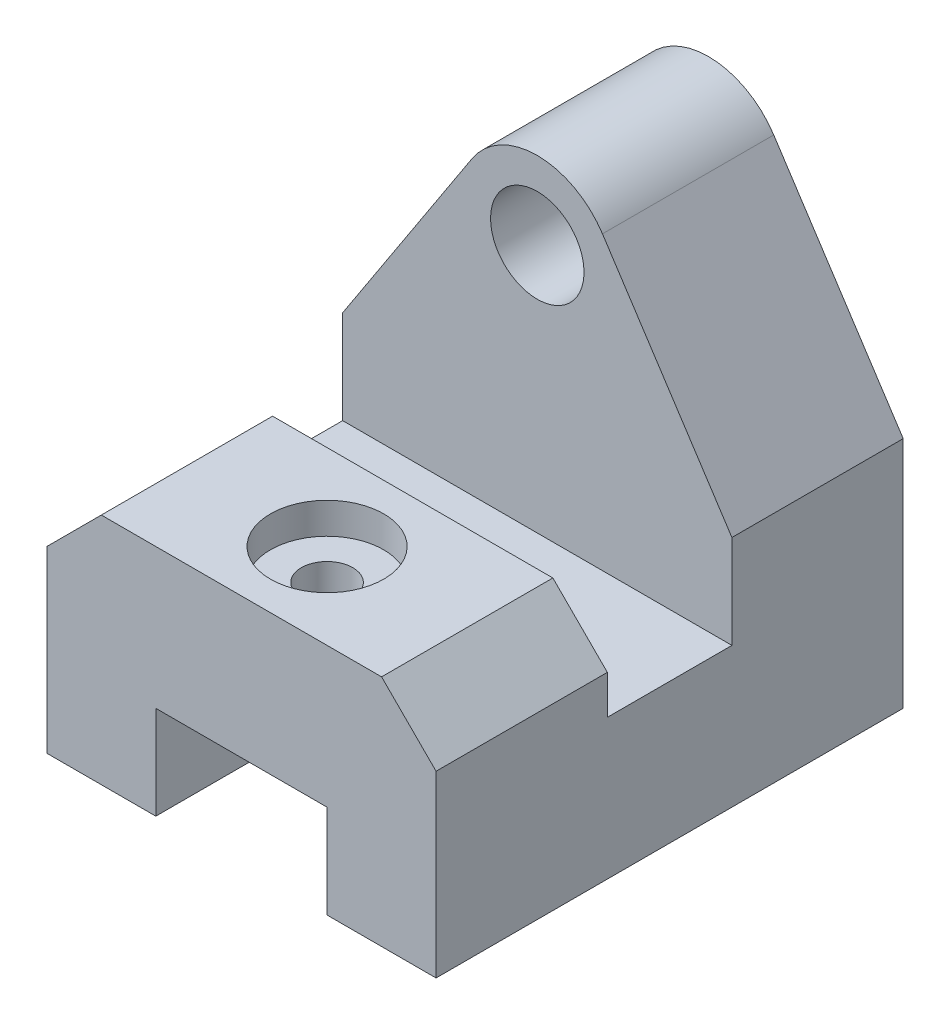
ISO-10303-21;
HEADER;
FILE_DESCRIPTION(('STEP AP214'),'2;1');
FILE_NAME('part.step','',(''),(''),'','','');
FILE_SCHEMA(('AUTOMOTIVE_DESIGN { 1 0 10303 214 1 1 1 1 }'));
ENDSEC;
DATA;
#1=APPLICATION_CONTEXT('core data for automotive mechanical design processes');
#2=APPLICATION_PROTOCOL_DEFINITION('international standard','automotive_design',2000,#1);
#3=PRODUCT_CONTEXT('',#1,'mechanical');
#4=PRODUCT('Part','Part','',(#3));
#5=PRODUCT_RELATED_PRODUCT_CATEGORY('part','',(#4));
#6=PRODUCT_DEFINITION_FORMATION('','',#4);
#7=PRODUCT_DEFINITION_CONTEXT('part definition',#1,'design');
#8=PRODUCT_DEFINITION('design','',#6,#7);
#9=PRODUCT_DEFINITION_SHAPE('','',#8);
#10=(LENGTH_UNIT() NAMED_UNIT(*) SI_UNIT(.MILLI.,.METRE.));
#11=(NAMED_UNIT(*) PLANE_ANGLE_UNIT() SI_UNIT($,.RADIAN.));
#12=(NAMED_UNIT(*) SI_UNIT($,.STERADIAN.) SOLID_ANGLE_UNIT());
#13=UNCERTAINTY_MEASURE_WITH_UNIT(LENGTH_MEASURE(1.E-05),#10,'distance_accuracy_value','');
#14=(GEOMETRIC_REPRESENTATION_CONTEXT(3) GLOBAL_UNCERTAINTY_ASSIGNED_CONTEXT((#13)) GLOBAL_UNIT_ASSIGNED_CONTEXT((#10,
#11,#12)) REPRESENTATION_CONTEXT('',''));
#15=CARTESIAN_POINT('',(0.,0.,0.));
#16=DIRECTION('',(0.,0.,1.));
#17=DIRECTION('',(1.,0.,0.));
#18=AXIS2_PLACEMENT_3D('',#15,#16,#17);
#19=CARTESIAN_POINT('',(0.,0.,-60.));
#20=DIRECTION('',(0.,-1.,0.));
#21=DIRECTION('',(0.,0.,-1.));
#22=AXIS2_PLACEMENT_3D('',#19,#20,#21);
#23=PLANE('',#22);
#24=DIRECTION('',(0.,0.,1.));
#25=VECTOR('',#24,1.);
#26=CARTESIAN_POINT('',(14.,0.,-60.));
#27=LINE('',#26,#25);
#28=CARTESIAN_POINT('',(14.,0.,-60.));
#29=VERTEX_POINT('',#28);
#30=CARTESIAN_POINT('',(14.,0.,0.));
#31=VERTEX_POINT('',#30);
#32=EDGE_CURVE('E298',#29,#31,#27,.T.);
#33=ORIENTED_EDGE('',*,*,#32,.T.);
#34=DIRECTION('',(1.,0.,0.));
#35=VECTOR('',#34,1.);
#36=CARTESIAN_POINT('',(0.,0.,0.));
#37=LINE('',#36,#35);
#38=CARTESIAN_POINT('',(0.,0.,0.));
#39=VERTEX_POINT('',#38);
#40=EDGE_CURVE('E201',#39,#31,#37,.T.);
#41=ORIENTED_EDGE('',*,*,#40,.F.);
#42=DIRECTION('',(0.,0.,1.));
#43=VECTOR('',#42,1.);
#44=CARTESIAN_POINT('',(0.,0.,-60.));
#45=LINE('',#44,#43);
#46=CARTESIAN_POINT('',(0.,0.,-60.));
#47=VERTEX_POINT('',#46);
#48=EDGE_CURVE('E212',#47,#39,#45,.T.);
#49=ORIENTED_EDGE('',*,*,#48,.F.);
#50=DIRECTION('',(1.,0.,0.));
#51=VECTOR('',#50,1.);
#52=CARTESIAN_POINT('',(0.,0.,-60.));
#53=LINE('',#52,#51);
#54=EDGE_CURVE('E220',#47,#29,#53,.T.);
#55=ORIENTED_EDGE('',*,*,#54,.T.);
#56=EDGE_LOOP('',(#33,#41,#49,#55));
#57=FACE_BOUND('',#56,.T.);
#58=ADVANCED_FACE('F63',(#57),#23,.T.);
#59=CARTESIAN_POINT('',(0.,30.,-60.));
#60=DIRECTION('',(0.,1.,0.));
#61=DIRECTION('',(0.,0.,1.));
#62=AXIS2_PLACEMENT_3D('',#59,#60,#61);
#63=PLANE('',#62);
#64=CARTESIAN_POINT('',(25.,30.,-11.));
#65=DIRECTION('',(0.,1.,0.));
#66=DIRECTION('',(0.,0.,1.));
#67=AXIS2_PLACEMENT_3D('',#64,#65,#66);
#68=CIRCLE('',#67,7.2735);
#69=CARTESIAN_POINT('',(25.,30.,-3.7265));
#70=VERTEX_POINT('',#69);
#71=EDGE_CURVE('E335',#70,#70,#68,.T.);
#72=ORIENTED_EDGE('',*,*,#71,.F.);
#73=EDGE_LOOP('',(#72));
#74=FACE_BOUND('',#73,.T.);
#75=DIRECTION('',(0.,0.,1.));
#76=VECTOR('',#75,1.);
#77=CARTESIAN_POINT('',(43.,30.,-60.001));
#78=LINE('',#77,#76);
#79=CARTESIAN_POINT('',(43.,30.,-22.));
#80=VERTEX_POINT('',#79);
#81=CARTESIAN_POINT('',(43.,30.,0.));
#82=VERTEX_POINT('',#81);
#83=EDGE_CURVE('E179',#80,#82,#78,.T.);
#84=ORIENTED_EDGE('',*,*,#83,.F.);
#85=DIRECTION('',(1.,0.,0.));
#86=VECTOR('',#85,1.);
#87=CARTESIAN_POINT('',(0.,30.,-22.));
#88=LINE('',#87,#86);
#89=CARTESIAN_POINT('',(6.99999999999998,30.,-22.));
#90=VERTEX_POINT('',#89);
#91=EDGE_CURVE('E277',#90,#80,#88,.T.);
#92=ORIENTED_EDGE('',*,*,#91,.F.);
#93=DIRECTION('',(0.,0.,1.));
#94=VECTOR('',#93,1.);
#95=CARTESIAN_POINT('',(6.99999999999999,30.,-60.001));
#96=LINE('',#95,#94);
#97=CARTESIAN_POINT('',(6.99999999999999,30.,0.));
#98=VERTEX_POINT('',#97);
#99=EDGE_CURVE('E80',#90,#98,#96,.T.);
#100=ORIENTED_EDGE('',*,*,#99,.T.);
#101=DIRECTION('',(-1.,0.,0.));
#102=VECTOR('',#101,1.);
#103=CARTESIAN_POINT('',(0.,30.,0.));
#104=LINE('',#103,#102);
#105=EDGE_CURVE('E200',#82,#98,#104,.T.);
#106=ORIENTED_EDGE('',*,*,#105,.F.);
#107=EDGE_LOOP('',(#84,#92,#100,#106));
#108=FACE_BOUND('',#107,.T.);
#109=ADVANCED_FACE('F341',(#74,#108),#63,.T.);
#110=CARTESIAN_POINT('',(0.,0.,-60.));
#111=DIRECTION('',(-1.,0.,0.));
#112=DIRECTION('',(0.,-1.,0.));
#113=AXIS2_PLACEMENT_3D('',#110,#111,#112);
#114=PLANE('',#113);
#115=DIRECTION('',(0.,0.,1.));
#116=VECTOR('',#115,1.);
#117=CARTESIAN_POINT('',(0.,23.,-60.001));
#118=LINE('',#117,#116);
#119=CARTESIAN_POINT('',(0.,23.,-22.));
#120=VERTEX_POINT('',#119);
#121=CARTESIAN_POINT('',(0.,23.,0.));
#122=VERTEX_POINT('',#121);
#123=EDGE_CURVE('E321',#120,#122,#118,.T.);
#124=ORIENTED_EDGE('',*,*,#123,.F.);
#125=DIRECTION('',(0.,-1.,0.));
#126=VECTOR('',#125,1.);
#127=CARTESIAN_POINT('',(0.,30.,-22.));
#128=LINE('',#127,#126);
#129=CARTESIAN_POINT('',(0.,18.,-22.));
#130=VERTEX_POINT('',#129);
#131=EDGE_CURVE('E295',#120,#130,#128,.T.);
#132=ORIENTED_EDGE('',*,*,#131,.T.);
#133=DIRECTION('',(0.,0.,-1.));
#134=VECTOR('',#133,1.);
#135=CARTESIAN_POINT('',(0.,18.,-38.));
#136=LINE('',#135,#134);
#137=CARTESIAN_POINT('',(0.,18.,-38.));
#138=VERTEX_POINT('',#137);
#139=EDGE_CURVE('E281',#130,#138,#136,.T.);
#140=ORIENTED_EDGE('',*,*,#139,.T.);
#141=DIRECTION('',(0.,1.,0.));
#142=VECTOR('',#141,1.);
#143=CARTESIAN_POINT('',(0.,30.,-38.));
#144=LINE('',#143,#142);
#145=CARTESIAN_POINT('',(0.,30.,-38.));
#146=VERTEX_POINT('',#145);
#147=EDGE_CURVE('E288',#138,#146,#144,.T.);
#148=ORIENTED_EDGE('',*,*,#147,.T.);
#149=DIRECTION('',(0.,0.,1.));
#150=VECTOR('',#149,1.);
#151=CARTESIAN_POINT('',(0.,30.,-60.));
#152=LINE('',#151,#150);
#153=CARTESIAN_POINT('',(0.,30.,-60.));
#154=VERTEX_POINT('',#153);
#155=EDGE_CURVE('E14',#154,#146,#152,.T.);
#156=ORIENTED_EDGE('',*,*,#155,.F.);
#157=DIRECTION('',(0.,-1.,0.));
#158=VECTOR('',#157,1.);
#159=CARTESIAN_POINT('',(0.,0.,-60.));
#160=LINE('',#159,#158);
#161=EDGE_CURVE('E203',#154,#47,#160,.T.);
#162=ORIENTED_EDGE('',*,*,#161,.T.);
#163=ORIENTED_EDGE('',*,*,#48,.T.);
#164=DIRECTION('',(0.,-1.,0.));
#165=VECTOR('',#164,1.);
#166=CARTESIAN_POINT('',(0.,0.,0.));
#167=LINE('',#166,#165);
#168=EDGE_CURVE('E227',#122,#39,#167,.T.);
#169=ORIENTED_EDGE('',*,*,#168,.F.);
#170=EDGE_LOOP('',(#124,#132,#140,#148,#156,#162,#163,#169));
#171=FACE_BOUND('',#170,.T.);
#172=ADVANCED_FACE('F65',(#171),#114,.T.);
#173=CARTESIAN_POINT('',(50.,0.,-60.));
#174=DIRECTION('',(1.,0.,0.));
#175=DIRECTION('',(0.,1.,0.));
#176=AXIS2_PLACEMENT_3D('',#173,#174,#175);
#177=PLANE('',#176);
#178=DIRECTION('',(0.,0.,1.));
#179=VECTOR('',#178,1.);
#180=CARTESIAN_POINT('',(50.,23.,-60.001));
#181=LINE('',#180,#179);
#182=CARTESIAN_POINT('',(50.,23.,-22.));
#183=VERTEX_POINT('',#182);
#184=CARTESIAN_POINT('',(50.,23.,0.));
#185=VERTEX_POINT('',#184);
#186=EDGE_CURVE('E88',#183,#185,#181,.T.);
#187=ORIENTED_EDGE('',*,*,#186,.T.);
#188=DIRECTION('',(0.,1.,0.));
#189=VECTOR('',#188,1.);
#190=CARTESIAN_POINT('',(50.,0.,0.));
#191=LINE('',#190,#189);
#192=CARTESIAN_POINT('',(50.,0.,0.));
#193=VERTEX_POINT('',#192);
#194=EDGE_CURVE('E191',#193,#185,#191,.T.);
#195=ORIENTED_EDGE('',*,*,#194,.F.);
#196=DIRECTION('',(0.,0.,1.));
#197=VECTOR('',#196,1.);
#198=CARTESIAN_POINT('',(50.,0.,-60.));
#199=LINE('',#198,#197);
#200=CARTESIAN_POINT('',(50.,0.,-60.));
#201=VERTEX_POINT('',#200);
#202=EDGE_CURVE('E211',#201,#193,#199,.T.);
#203=ORIENTED_EDGE('',*,*,#202,.F.);
#204=DIRECTION('',(0.,1.,0.));
#205=VECTOR('',#204,1.);
#206=CARTESIAN_POINT('',(50.,0.,-60.));
#207=LINE('',#206,#205);
#208=CARTESIAN_POINT('',(50.,30.,-60.));
#209=VERTEX_POINT('',#208);
#210=EDGE_CURVE('E214',#201,#209,#207,.T.);
#211=ORIENTED_EDGE('',*,*,#210,.T.);
#212=DIRECTION('',(0.,0.,1.));
#213=VECTOR('',#212,1.);
#214=CARTESIAN_POINT('',(50.,30.,-60.));
#215=LINE('',#214,#213);
#216=CARTESIAN_POINT('',(50.,30.,-38.));
#217=VERTEX_POINT('',#216);
#218=EDGE_CURVE('E72',#209,#217,#215,.T.);
#219=ORIENTED_EDGE('',*,*,#218,.T.);
#220=DIRECTION('',(0.,1.,0.));
#221=VECTOR('',#220,1.);
#222=CARTESIAN_POINT('',(50.,30.,-38.));
#223=LINE('',#222,#221);
#224=CARTESIAN_POINT('',(50.,18.,-38.));
#225=VERTEX_POINT('',#224);
#226=EDGE_CURVE('E290',#225,#217,#223,.T.);
#227=ORIENTED_EDGE('',*,*,#226,.F.);
#228=DIRECTION('',(0.,0.,-1.));
#229=VECTOR('',#228,1.);
#230=CARTESIAN_POINT('',(50.,18.,-38.));
#231=LINE('',#230,#229);
#232=CARTESIAN_POINT('',(50.,18.,-22.));
#233=VERTEX_POINT('',#232);
#234=EDGE_CURVE('E285',#233,#225,#231,.T.);
#235=ORIENTED_EDGE('',*,*,#234,.F.);
#236=DIRECTION('',(0.,-1.,0.));
#237=VECTOR('',#236,1.);
#238=CARTESIAN_POINT('',(50.,30.,-22.));
#239=LINE('',#238,#237);
#240=EDGE_CURVE('E193',#183,#233,#239,.T.);
#241=ORIENTED_EDGE('',*,*,#240,.F.);
#242=EDGE_LOOP('',(#187,#195,#203,#211,#219,#227,#235,#241));
#243=FACE_BOUND('',#242,.T.);
#244=ADVANCED_FACE('F189',(#243),#177,.T.);
#245=DIRECTION('',(0.,0.,1.));
#246=VECTOR('',#245,1.);
#247=CARTESIAN_POINT('',(36.,0.,-60.));
#248=LINE('',#247,#246);
#249=CARTESIAN_POINT('',(36.,0.,-60.));
#250=VERTEX_POINT('',#249);
#251=CARTESIAN_POINT('',(36.,0.,0.));
#252=VERTEX_POINT('',#251);
#253=EDGE_CURVE('E246',#250,#252,#248,.T.);
#254=ORIENTED_EDGE('',*,*,#253,.F.);
#255=EDGE_CURVE('E224',#250,#201,#53,.T.);
#256=ORIENTED_EDGE('',*,*,#255,.T.);
#257=ORIENTED_EDGE('',*,*,#202,.T.);
#258=EDGE_CURVE('E198',#252,#193,#37,.T.);
#259=ORIENTED_EDGE('',*,*,#258,.F.);
#260=EDGE_LOOP('',(#254,#256,#257,#259));
#261=FACE_BOUND('',#260,.T.);
#262=ADVANCED_FACE('F245',(#261),#23,.T.);
#263=CARTESIAN_POINT('',(0.,0.,-60.));
#264=DIRECTION('',(0.,0.,-1.));
#265=DIRECTION('',(-1.,0.,0.));
#266=AXIS2_PLACEMENT_3D('',#263,#264,#265);
#267=PLANE('',#266);
#268=DIRECTION('',(0.,-1.,0.));
#269=VECTOR('',#268,1.);
#270=CARTESIAN_POINT('',(14.,0.,-60.));
#271=LINE('',#270,#269);
#272=CARTESIAN_POINT('',(14.,12.,-60.));
#273=VERTEX_POINT('',#272);
#274=EDGE_CURVE('E309',#273,#29,#271,.T.);
#275=ORIENTED_EDGE('',*,*,#274,.T.);
#276=ORIENTED_EDGE('',*,*,#54,.F.);
#277=ORIENTED_EDGE('',*,*,#161,.F.);
#278=DIRECTION('',(0.546678357353442,0.837342685882753,0.));
#279=VECTOR('',#278,1.);
#280=CARTESIAN_POINT('',(0.,30.,-60.));
#281=LINE('',#280,#279);
#282=CARTESIAN_POINT('',(16.6265731411725,55.4667835735344,-60.));
#283=VERTEX_POINT('',#282);
#284=EDGE_CURVE('E260',#154,#283,#281,.T.);
#285=ORIENTED_EDGE('',*,*,#284,.T.);
#286=CARTESIAN_POINT('',(25.,50.,-60.));
#287=DIRECTION('',(0.,0.,-1.));
#288=DIRECTION('',(-1.,0.,0.));
#289=AXIS2_PLACEMENT_3D('',#286,#287,#288);
#290=CIRCLE('',#289,9.99999999999999);
#291=CARTESIAN_POINT('',(33.3734268588275,55.4667835735344,-60.));
#292=VERTEX_POINT('',#291);
#293=EDGE_CURVE('E256',#283,#292,#290,.T.);
#294=ORIENTED_EDGE('',*,*,#293,.T.);
#295=DIRECTION('',(-0.546678357353442,0.837342685882753,0.));
#296=VECTOR('',#295,1.);
#297=CARTESIAN_POINT('',(50.,30.,-60.));
#298=LINE('',#297,#296);
#299=EDGE_CURVE('E254',#209,#292,#298,.T.);
#300=ORIENTED_EDGE('',*,*,#299,.F.);
#301=ORIENTED_EDGE('',*,*,#210,.F.);
#302=ORIENTED_EDGE('',*,*,#255,.F.);
#303=DIRECTION('',(0.,1.,0.));
#304=VECTOR('',#303,1.);
#305=CARTESIAN_POINT('',(36.,0.,-60.));
#306=LINE('',#305,#304);
#307=CARTESIAN_POINT('',(36.,12.,-60.));
#308=VERTEX_POINT('',#307);
#309=EDGE_CURVE('E317',#250,#308,#306,.T.);
#310=ORIENTED_EDGE('',*,*,#309,.T.);
#311=DIRECTION('',(-1.,0.,0.));
#312=VECTOR('',#311,1.);
#313=CARTESIAN_POINT('',(14.,12.,-60.));
#314=LINE('',#313,#312);
#315=EDGE_CURVE('E301',#308,#273,#314,.T.);
#316=ORIENTED_EDGE('',*,*,#315,.T.);
#317=EDGE_LOOP('',(#275,#276,#277,#285,#294,#300,#301,#302,#310,#316));
#318=FACE_BOUND('',#317,.T.);
#319=CARTESIAN_POINT('',(25.,50.,-60.));
#320=DIRECTION('',(0.,0.,-1.));
#321=DIRECTION('',(-1.,0.,0.));
#322=AXIS2_PLACEMENT_3D('',#319,#320,#321);
#323=CIRCLE('',#322,6.);
#324=CARTESIAN_POINT('',(19.,50.,-60.));
#325=VERTEX_POINT('',#324);
#326=EDGE_CURVE('E263',#325,#325,#323,.T.);
#327=ORIENTED_EDGE('',*,*,#326,.F.);
#328=EDGE_LOOP('',(#327));
#329=FACE_BOUND('',#328,.T.);
#330=ADVANCED_FACE('F251',(#318,#329),#267,.T.);
#331=CARTESIAN_POINT('',(0.,0.,0.));
#332=DIRECTION('',(0.,0.,-1.));
#333=DIRECTION('',(-1.,0.,0.));
#334=AXIS2_PLACEMENT_3D('',#331,#332,#333);
#335=PLANE('',#334);
#336=ORIENTED_EDGE('',*,*,#194,.T.);
#337=DIRECTION('',(0.707106781186548,-0.707106781186547,0.));
#338=VECTOR('',#337,1.);
#339=CARTESIAN_POINT('',(50.,23.,0.));
#340=LINE('',#339,#338);
#341=EDGE_CURVE('E176',#82,#185,#340,.T.);
#342=ORIENTED_EDGE('',*,*,#341,.F.);
#343=ORIENTED_EDGE('',*,*,#105,.T.);
#344=DIRECTION('',(0.707106781186548,0.707106781186547,0.));
#345=VECTOR('',#344,1.);
#346=CARTESIAN_POINT('',(6.99999999999999,30.,0.));
#347=LINE('',#346,#345);
#348=EDGE_CURVE('E323',#122,#98,#347,.T.);
#349=ORIENTED_EDGE('',*,*,#348,.F.);
#350=ORIENTED_EDGE('',*,*,#168,.T.);
#351=ORIENTED_EDGE('',*,*,#40,.T.);
#352=DIRECTION('',(0.,-1.,0.));
#353=VECTOR('',#352,1.);
#354=CARTESIAN_POINT('',(14.,0.,0.));
#355=LINE('',#354,#353);
#356=CARTESIAN_POINT('',(14.,12.,0.));
#357=VERTEX_POINT('',#356);
#358=EDGE_CURVE('E313',#357,#31,#355,.T.);
#359=ORIENTED_EDGE('',*,*,#358,.F.);
#360=DIRECTION('',(-1.,0.,0.));
#361=VECTOR('',#360,1.);
#362=CARTESIAN_POINT('',(14.,12.,0.));
#363=LINE('',#362,#361);
#364=CARTESIAN_POINT('',(36.,12.,0.));
#365=VERTEX_POINT('',#364);
#366=EDGE_CURVE('E306',#365,#357,#363,.T.);
#367=ORIENTED_EDGE('',*,*,#366,.F.);
#368=DIRECTION('',(0.,1.,0.));
#369=VECTOR('',#368,1.);
#370=CARTESIAN_POINT('',(36.,0.,0.));
#371=LINE('',#370,#369);
#372=EDGE_CURVE('E310',#252,#365,#371,.T.);
#373=ORIENTED_EDGE('',*,*,#372,.F.);
#374=ORIENTED_EDGE('',*,*,#258,.T.);
#375=EDGE_LOOP('',(#336,#342,#343,#349,#350,#351,#359,#367,#373,#374));
#376=FACE_BOUND('',#375,.T.);
#377=ADVANCED_FACE('F195',(#376),#335,.F.);
#378=CARTESIAN_POINT('',(50.,30.,-38.));
#379=DIRECTION('',(-0.837342685882753,-0.546678357353442,0.));
#380=DIRECTION('',(0.546678357353442,-0.837342685882753,0.));
#381=AXIS2_PLACEMENT_3D('',#378,#379,#380);
#382=PLANE('',#381);
#383=ORIENTED_EDGE('',*,*,#299,.T.);
#384=DIRECTION('',(0.,0.,-1.));
#385=VECTOR('',#384,1.);
#386=CARTESIAN_POINT('',(33.3734268588275,55.4667835735344,-38.));
#387=LINE('',#386,#385);
#388=CARTESIAN_POINT('',(33.3734268588275,55.4667835735344,-38.));
#389=VERTEX_POINT('',#388);
#390=EDGE_CURVE('E228',#389,#292,#387,.T.);
#391=ORIENTED_EDGE('',*,*,#390,.F.);
#392=DIRECTION('',(-0.546678357353442,0.837342685882753,0.));
#393=VECTOR('',#392,1.);
#394=CARTESIAN_POINT('',(50.,30.,-38.));
#395=LINE('',#394,#393);
#396=EDGE_CURVE('E267',#217,#389,#395,.T.);
#397=ORIENTED_EDGE('',*,*,#396,.F.);
#398=ORIENTED_EDGE('',*,*,#218,.F.);
#399=EDGE_LOOP('',(#383,#391,#397,#398));
#400=FACE_BOUND('',#399,.T.);
#401=ADVANCED_FACE('F398',(#400),#382,.F.);
#402=CARTESIAN_POINT('',(25.,50.,-38.));
#403=DIRECTION('',(0.,0.,-1.));
#404=DIRECTION('',(-1.,0.,0.));
#405=AXIS2_PLACEMENT_3D('',#402,#403,#404);
#406=CYLINDRICAL_SURFACE('',#405,9.99999999999999);
#407=ORIENTED_EDGE('',*,*,#293,.F.);
#408=DIRECTION('',(0.,0.,-1.));
#409=VECTOR('',#408,1.);
#410=CARTESIAN_POINT('',(16.6265731411725,55.4667835735344,-38.));
#411=LINE('',#410,#409);
#412=CARTESIAN_POINT('',(16.6265731411725,55.4667835735344,-38.));
#413=VERTEX_POINT('',#412);
#414=EDGE_CURVE('E230',#413,#283,#411,.T.);
#415=ORIENTED_EDGE('',*,*,#414,.F.);
#416=CARTESIAN_POINT('',(25.,50.,-38.));
#417=DIRECTION('',(0.,0.,-1.));
#418=DIRECTION('',(-1.,0.,0.));
#419=AXIS2_PLACEMENT_3D('',#416,#417,#418);
#420=CIRCLE('',#419,9.99999999999999);
#421=EDGE_CURVE('E268',#413,#389,#420,.T.);
#422=ORIENTED_EDGE('',*,*,#421,.T.);
#423=ORIENTED_EDGE('',*,*,#390,.T.);
#424=EDGE_LOOP('',(#407,#415,#422,#423));
#425=FACE_BOUND('',#424,.T.);
#426=ADVANCED_FACE('F402',(#425),#406,.T.);
#427=CARTESIAN_POINT('',(0.,30.,-38.));
#428=DIRECTION('',(-0.837342685882753,0.546678357353442,0.));
#429=DIRECTION('',(-0.546678357353442,-0.837342685882753,0.));
#430=AXIS2_PLACEMENT_3D('',#427,#428,#429);
#431=PLANE('',#430);
#432=ORIENTED_EDGE('',*,*,#284,.F.);
#433=ORIENTED_EDGE('',*,*,#155,.T.);
#434=DIRECTION('',(0.546678357353442,0.837342685882753,0.));
#435=VECTOR('',#434,1.);
#436=CARTESIAN_POINT('',(0.,30.,-38.));
#437=LINE('',#436,#435);
#438=EDGE_CURVE('E237',#146,#413,#437,.T.);
#439=ORIENTED_EDGE('',*,*,#438,.T.);
#440=ORIENTED_EDGE('',*,*,#414,.T.);
#441=EDGE_LOOP('',(#432,#433,#439,#440));
#442=FACE_BOUND('',#441,.T.);
#443=ADVANCED_FACE('F405',(#442),#431,.T.);
#444=CARTESIAN_POINT('',(25.,50.,-38.));
#445=DIRECTION('',(0.,0.,-1.));
#446=DIRECTION('',(-1.,0.,0.));
#447=AXIS2_PLACEMENT_3D('',#444,#445,#446);
#448=PLANE('',#447);
#449=CARTESIAN_POINT('',(25.,50.,-38.));
#450=DIRECTION('',(0.,0.,-1.));
#451=DIRECTION('',(-1.,0.,0.));
#452=AXIS2_PLACEMENT_3D('',#449,#450,#451);
#453=CIRCLE('',#452,6.);
#454=CARTESIAN_POINT('',(19.,50.,-38.));
#455=VERTEX_POINT('',#454);
#456=EDGE_CURVE('E258',#455,#455,#453,.T.);
#457=ORIENTED_EDGE('',*,*,#456,.T.);
#458=EDGE_LOOP('',(#457));
#459=FACE_BOUND('',#458,.T.);
#460=ORIENTED_EDGE('',*,*,#396,.T.);
#461=ORIENTED_EDGE('',*,*,#421,.F.);
#462=ORIENTED_EDGE('',*,*,#438,.F.);
#463=ORIENTED_EDGE('',*,*,#147,.F.);
#464=DIRECTION('',(1.,0.,0.));
#465=VECTOR('',#464,1.);
#466=CARTESIAN_POINT('',(0.,18.,-38.));
#467=LINE('',#466,#465);
#468=EDGE_CURVE('E275',#138,#225,#467,.T.);
#469=ORIENTED_EDGE('',*,*,#468,.T.);
#470=ORIENTED_EDGE('',*,*,#226,.T.);
#471=EDGE_LOOP('',(#460,#461,#462,#463,#469,#470));
#472=FACE_BOUND('',#471,.T.);
#473=ADVANCED_FACE('F358',(#459,#472),#448,.F.);
#474=CARTESIAN_POINT('',(25.,50.,-38.));
#475=DIRECTION('',(0.,0.,-1.));
#476=DIRECTION('',(-1.,0.,0.));
#477=AXIS2_PLACEMENT_3D('',#474,#475,#476);
#478=CYLINDRICAL_SURFACE('',#477,6.);
#479=ORIENTED_EDGE('',*,*,#456,.F.);
#480=EDGE_LOOP('',(#479));
#481=FACE_BOUND('',#480,.T.);
#482=ORIENTED_EDGE('',*,*,#326,.T.);
#483=EDGE_LOOP('',(#482));
#484=FACE_BOUND('',#483,.T.);
#485=ADVANCED_FACE('F410',(#481,#484),#478,.F.);
#486=CARTESIAN_POINT('',(0.,18.,-38.));
#487=DIRECTION('',(0.,-1.,0.));
#488=DIRECTION('',(0.,0.,-1.));
#489=AXIS2_PLACEMENT_3D('',#486,#487,#488);
#490=PLANE('',#489);
#491=ORIENTED_EDGE('',*,*,#234,.T.);
#492=ORIENTED_EDGE('',*,*,#468,.F.);
#493=ORIENTED_EDGE('',*,*,#139,.F.);
#494=DIRECTION('',(1.,0.,0.));
#495=VECTOR('',#494,1.);
#496=CARTESIAN_POINT('',(0.,18.,-22.));
#497=LINE('',#496,#495);
#498=EDGE_CURVE('E280',#130,#233,#497,.T.);
#499=ORIENTED_EDGE('',*,*,#498,.T.);
#500=EDGE_LOOP('',(#491,#492,#493,#499));
#501=FACE_BOUND('',#500,.T.);
#502=ADVANCED_FACE('F354',(#501),#490,.F.);
#503=CARTESIAN_POINT('',(0.,30.,-22.));
#504=DIRECTION('',(0.,0.,1.));
#505=DIRECTION('',(1.,0.,0.));
#506=AXIS2_PLACEMENT_3D('',#503,#504,#505);
#507=PLANE('',#506);
#508=ORIENTED_EDGE('',*,*,#91,.T.);
#509=DIRECTION('',(-0.707106781186548,0.707106781186547,0.));
#510=VECTOR('',#509,1.);
#511=CARTESIAN_POINT('',(50.,23.,-22.));
#512=LINE('',#511,#510);
#513=EDGE_CURVE('E184',#183,#80,#512,.T.);
#514=ORIENTED_EDGE('',*,*,#513,.F.);
#515=ORIENTED_EDGE('',*,*,#240,.T.);
#516=ORIENTED_EDGE('',*,*,#498,.F.);
#517=ORIENTED_EDGE('',*,*,#131,.F.);
#518=DIRECTION('',(-0.707106781186548,-0.707106781186547,0.));
#519=VECTOR('',#518,1.);
#520=CARTESIAN_POINT('',(6.99999999999999,30.,-22.));
#521=LINE('',#520,#519);
#522=EDGE_CURVE('E324',#90,#120,#521,.T.);
#523=ORIENTED_EDGE('',*,*,#522,.F.);
#524=EDGE_LOOP('',(#508,#514,#515,#516,#517,#523));
#525=FACE_BOUND('',#524,.T.);
#526=ADVANCED_FACE('F347',(#525),#507,.F.);
#527=CARTESIAN_POINT('',(14.,0.,-60.));
#528=DIRECTION('',(-1.,0.,0.));
#529=DIRECTION('',(0.,0.,1.));
#530=AXIS2_PLACEMENT_3D('',#527,#528,#529);
#531=PLANE('',#530);
#532=ORIENTED_EDGE('',*,*,#358,.T.);
#533=ORIENTED_EDGE('',*,*,#32,.F.);
#534=ORIENTED_EDGE('',*,*,#274,.F.);
#535=DIRECTION('',(0.,0.,1.));
#536=VECTOR('',#535,1.);
#537=CARTESIAN_POINT('',(14.,12.,-60.));
#538=LINE('',#537,#536);
#539=EDGE_CURVE('E292',#273,#357,#538,.T.);
#540=ORIENTED_EDGE('',*,*,#539,.T.);
#541=EDGE_LOOP('',(#532,#533,#534,#540));
#542=FACE_BOUND('',#541,.T.);
#543=ADVANCED_FACE('F367',(#542),#531,.F.);
#544=CARTESIAN_POINT('',(14.,12.,-60.));
#545=DIRECTION('',(0.,1.,0.));
#546=DIRECTION('',(0.,0.,1.));
#547=AXIS2_PLACEMENT_3D('',#544,#545,#546);
#548=PLANE('',#547);
#549=CARTESIAN_POINT('',(25.,12.,-11.));
#550=DIRECTION('',(0.,1.,0.));
#551=DIRECTION('',(0.,0.,1.));
#552=AXIS2_PLACEMENT_3D('',#549,#550,#551);
#553=CIRCLE('',#552,3.3);
#554=CARTESIAN_POINT('',(25.,12.,-7.7));
#555=VERTEX_POINT('',#554);
#556=EDGE_CURVE('E67',#555,#555,#553,.T.);
#557=ORIENTED_EDGE('',*,*,#556,.T.);
#558=EDGE_LOOP('',(#557));
#559=FACE_BOUND('',#558,.T.);
#560=ORIENTED_EDGE('',*,*,#366,.T.);
#561=ORIENTED_EDGE('',*,*,#539,.F.);
#562=ORIENTED_EDGE('',*,*,#315,.F.);
#563=DIRECTION('',(0.,0.,1.));
#564=VECTOR('',#563,1.);
#565=CARTESIAN_POINT('',(36.,12.,-60.));
#566=LINE('',#565,#564);
#567=EDGE_CURVE('E303',#308,#365,#566,.T.);
#568=ORIENTED_EDGE('',*,*,#567,.T.);
#569=EDGE_LOOP('',(#560,#561,#562,#568));
#570=FACE_BOUND('',#569,.T.);
#571=ADVANCED_FACE('F370',(#559,#570),#548,.F.);
#572=CARTESIAN_POINT('',(36.,0.,-60.));
#573=DIRECTION('',(1.,0.,0.));
#574=DIRECTION('',(0.,0.,-1.));
#575=AXIS2_PLACEMENT_3D('',#572,#573,#574);
#576=PLANE('',#575);
#577=ORIENTED_EDGE('',*,*,#372,.T.);
#578=ORIENTED_EDGE('',*,*,#567,.F.);
#579=ORIENTED_EDGE('',*,*,#309,.F.);
#580=ORIENTED_EDGE('',*,*,#253,.T.);
#581=EDGE_LOOP('',(#577,#578,#579,#580));
#582=FACE_BOUND('',#581,.T.);
#583=ADVANCED_FACE('F372',(#582),#576,.F.);
#584=CARTESIAN_POINT('',(6.99999999999999,30.,-60.001));
#585=DIRECTION('',(0.707106781186547,-0.707106781186547,0.));
#586=DIRECTION('',(0.707106781186548,0.707106781186547,0.));
#587=AXIS2_PLACEMENT_3D('',#584,#585,#586);
#588=PLANE('',#587);
#589=ORIENTED_EDGE('',*,*,#522,.T.);
#590=ORIENTED_EDGE('',*,*,#123,.T.);
#591=ORIENTED_EDGE('',*,*,#348,.T.);
#592=ORIENTED_EDGE('',*,*,#99,.F.);
#593=EDGE_LOOP('',(#589,#590,#591,#592));
#594=FACE_BOUND('',#593,.T.);
#595=ADVANCED_FACE('F351',(#594),#588,.F.);
#596=CARTESIAN_POINT('',(50.,23.,-60.001));
#597=DIRECTION('',(-0.707106781186547,-0.707106781186548,0.));
#598=DIRECTION('',(0.707106781186548,-0.707106781186547,0.));
#599=AXIS2_PLACEMENT_3D('',#596,#597,#598);
#600=PLANE('',#599);
#601=ORIENTED_EDGE('',*,*,#513,.T.);
#602=ORIENTED_EDGE('',*,*,#83,.T.);
#603=ORIENTED_EDGE('',*,*,#341,.T.);
#604=ORIENTED_EDGE('',*,*,#186,.F.);
#605=EDGE_LOOP('',(#601,#602,#603,#604));
#606=FACE_BOUND('',#605,.T.);
#607=ADVANCED_FACE('F177',(#606),#600,.F.);
#608=CARTESIAN_POINT('',(25.,30.,-11.));
#609=DIRECTION('',(0.,1.,0.));
#610=DIRECTION('',(0.,0.,1.));
#611=AXIS2_PLACEMENT_3D('',#608,#609,#610);
#612=CYLINDRICAL_SURFACE('',#611,3.3);
#613=CARTESIAN_POINT('',(25.,26.,-11.));
#614=DIRECTION('',(0.,1.,0.));
#615=DIRECTION('',(0.,0.,1.));
#616=AXIS2_PLACEMENT_3D('',#613,#614,#615);
#617=CIRCLE('',#616,3.3);
#618=CARTESIAN_POINT('',(25.,26.,-7.7));
#619=VERTEX_POINT('',#618);
#620=EDGE_CURVE('E329',#619,#619,#617,.T.);
#621=ORIENTED_EDGE('',*,*,#620,.T.);
#622=EDGE_LOOP('',(#621));
#623=FACE_BOUND('',#622,.T.);
#624=ORIENTED_EDGE('',*,*,#556,.F.);
#625=EDGE_LOOP('',(#624));
#626=FACE_BOUND('',#625,.T.);
#627=ADVANCED_FACE('F438',(#623,#626),#612,.F.);
#628=CARTESIAN_POINT('',(28.3,26.,-11.));
#629=DIRECTION('',(0.,-1.,0.));
#630=DIRECTION('',(0.,0.,-1.));
#631=AXIS2_PLACEMENT_3D('',#628,#629,#630);
#632=PLANE('',#631);
#633=ORIENTED_EDGE('',*,*,#620,.F.);
#634=EDGE_LOOP('',(#633));
#635=FACE_BOUND('',#634,.T.);
#636=CARTESIAN_POINT('',(25.,26.,-11.));
#637=DIRECTION('',(0.,1.,0.));
#638=DIRECTION('',(0.,0.,1.));
#639=AXIS2_PLACEMENT_3D('',#636,#637,#638);
#640=CIRCLE('',#639,7.2735);
#641=CARTESIAN_POINT('',(25.,26.,-3.7265));
#642=VERTEX_POINT('',#641);
#643=EDGE_CURVE('E332',#642,#642,#640,.T.);
#644=ORIENTED_EDGE('',*,*,#643,.T.);
#645=EDGE_LOOP('',(#644));
#646=FACE_BOUND('',#645,.T.);
#647=ADVANCED_FACE('F444',(#635,#646),#632,.F.);
#648=CARTESIAN_POINT('',(25.,30.,-11.));
#649=DIRECTION('',(0.,1.,0.));
#650=DIRECTION('',(0.,0.,1.));
#651=AXIS2_PLACEMENT_3D('',#648,#649,#650);
#652=CYLINDRICAL_SURFACE('',#651,7.2735);
#653=ORIENTED_EDGE('',*,*,#643,.F.);
#654=EDGE_LOOP('',(#653));
#655=FACE_BOUND('',#654,.T.);
#656=ORIENTED_EDGE('',*,*,#71,.T.);
#657=EDGE_LOOP('',(#656));
#658=FACE_BOUND('',#657,.T.);
#659=ADVANCED_FACE('F339',(#655,#658),#652,.F.);
#660=CLOSED_SHELL('',(#58,#109,#172,#244,#262,#330,#377,#401,#426,#443,#473,#485,#502,#526,#543,
#571,#583,#595,#607,#627,#647,#659));
#661=MANIFOLD_SOLID_BREP('B2',#660);
#662=ADVANCED_BREP_SHAPE_REPRESENTATION('',(#18,#661),#14);
#663=SHAPE_DEFINITION_REPRESENTATION(#9,#662);
ENDSEC;
END-ISO-10303-21;
